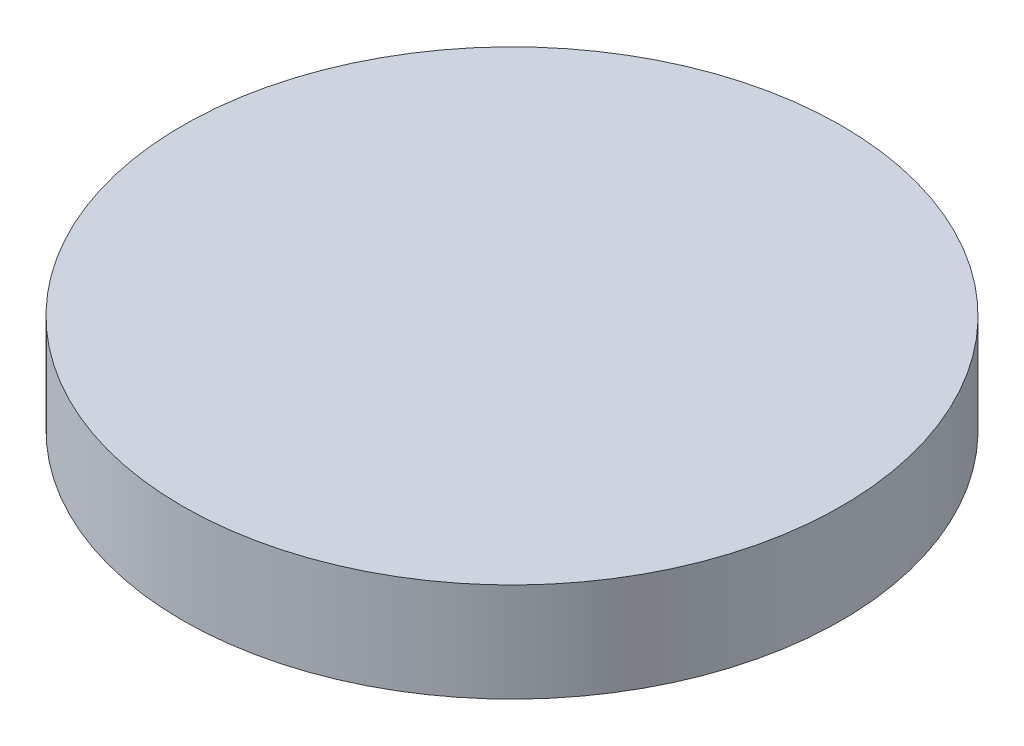
ISO-10303-21;
HEADER;
FILE_DESCRIPTION(('STEP AP214'),'2;1');
FILE_NAME('part.step','',(''),(''),'','','');
FILE_SCHEMA(('AUTOMOTIVE_DESIGN { 1 0 10303 214 1 1 1 1 }'));
ENDSEC;
DATA;
#1=APPLICATION_CONTEXT('core data for automotive mechanical design processes');
#2=APPLICATION_PROTOCOL_DEFINITION('international standard','automotive_design',2000,#1);
#3=PRODUCT_CONTEXT('',#1,'mechanical');
#4=PRODUCT('Part','Part','',(#3));
#5=PRODUCT_RELATED_PRODUCT_CATEGORY('part','',(#4));
#6=PRODUCT_DEFINITION_FORMATION('','',#4);
#7=PRODUCT_DEFINITION_CONTEXT('part definition',#1,'design');
#8=PRODUCT_DEFINITION('design','',#6,#7);
#9=PRODUCT_DEFINITION_SHAPE('','',#8);
#10=(LENGTH_UNIT() NAMED_UNIT(*) SI_UNIT(.MILLI.,.METRE.));
#11=(NAMED_UNIT(*) PLANE_ANGLE_UNIT() SI_UNIT($,.RADIAN.));
#12=(NAMED_UNIT(*) SI_UNIT($,.STERADIAN.) SOLID_ANGLE_UNIT());
#13=UNCERTAINTY_MEASURE_WITH_UNIT(LENGTH_MEASURE(1.E-05),#10,'distance_accuracy_value','');
#14=(GEOMETRIC_REPRESENTATION_CONTEXT(3) GLOBAL_UNCERTAINTY_ASSIGNED_CONTEXT((#13)) GLOBAL_UNIT_ASSIGNED_CONTEXT((#10,
#11,#12)) REPRESENTATION_CONTEXT('',''));
#15=CARTESIAN_POINT('',(0.,0.,0.));
#16=DIRECTION('',(0.,0.,1.));
#17=DIRECTION('',(1.,0.,0.));
#18=AXIS2_PLACEMENT_3D('',#15,#16,#17);
#19=CARTESIAN_POINT('',(0.,1.5,0.));
#20=DIRECTION('',(0.,-1.,0.));
#21=DIRECTION('',(0.,0.,-1.));
#22=AXIS2_PLACEMENT_3D('',#19,#20,#21);
#23=CYLINDRICAL_SURFACE('',#22,5.);
#24=CARTESIAN_POINT('',(0.,1.5,0.));
#25=DIRECTION('',(0.,1.,0.));
#26=DIRECTION('',(0.,0.,1.));
#27=AXIS2_PLACEMENT_3D('',#24,#25,#26);
#28=CIRCLE('',#27,5.);
#29=CARTESIAN_POINT('',(0.,1.5,5.));
#30=VERTEX_POINT('',#29);
#31=EDGE_CURVE('E10',#30,#30,#28,.T.);
#32=ORIENTED_EDGE('',*,*,#31,.F.);
#33=EDGE_LOOP('',(#32));
#34=FACE_BOUND('',#33,.T.);
#35=CARTESIAN_POINT('',(0.,0.,0.));
#36=DIRECTION('',(0.,1.,0.));
#37=DIRECTION('',(0.,0.,1.));
#38=AXIS2_PLACEMENT_3D('',#35,#36,#37);
#39=CIRCLE('',#38,5.);
#40=CARTESIAN_POINT('',(0.,0.,5.));
#41=VERTEX_POINT('',#40);
#42=EDGE_CURVE('E35',#41,#41,#39,.T.);
#43=ORIENTED_EDGE('',*,*,#42,.T.);
#44=EDGE_LOOP('',(#43));
#45=FACE_BOUND('',#44,.T.);
#46=ADVANCED_FACE('F32',(#34,#45),#23,.T.);
#47=CARTESIAN_POINT('',(0.,1.5,0.));
#48=DIRECTION('',(0.,1.,0.));
#49=DIRECTION('',(0.,0.,1.));
#50=AXIS2_PLACEMENT_3D('',#47,#48,#49);
#51=PLANE('',#50);
#52=ORIENTED_EDGE('',*,*,#31,.T.);
#53=EDGE_LOOP('',(#52));
#54=FACE_BOUND('',#53,.T.);
#55=ADVANCED_FACE('F47',(#54),#51,.T.);
#56=CARTESIAN_POINT('',(0.,0.,0.));
#57=DIRECTION('',(0.,1.,0.));
#58=DIRECTION('',(0.,0.,1.));
#59=AXIS2_PLACEMENT_3D('',#56,#57,#58);
#60=PLANE('',#59);
#61=ORIENTED_EDGE('',*,*,#42,.F.);
#62=EDGE_LOOP('',(#61));
#63=FACE_BOUND('',#62,.T.);
#64=ADVANCED_FACE('F45',(#63),#60,.F.);
#65=CLOSED_SHELL('',(#46,#55,#64));
#66=MANIFOLD_SOLID_BREP('B2',#65);
#67=ADVANCED_BREP_SHAPE_REPRESENTATION('',(#18,#66),#14);
#68=SHAPE_DEFINITION_REPRESENTATION(#9,#67);
ENDSEC;
END-ISO-10303-21;
